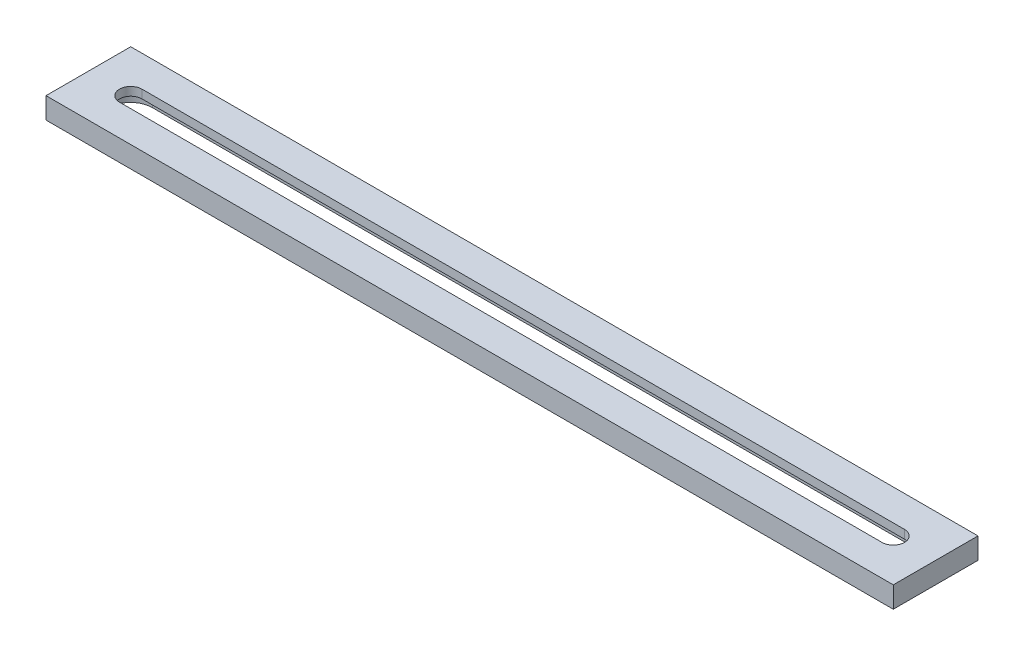
ISO-10303-21;
HEADER;
FILE_DESCRIPTION(('STEP AP214'),'2;1');
FILE_NAME('part.step','',(''),(''),'','','');
FILE_SCHEMA(('AUTOMOTIVE_DESIGN { 1 0 10303 214 1 1 1 1 }'));
ENDSEC;
DATA;
#1=APPLICATION_CONTEXT('core data for automotive mechanical design processes');
#2=APPLICATION_PROTOCOL_DEFINITION('international standard','automotive_design',2000,#1);
#3=PRODUCT_CONTEXT('',#1,'mechanical');
#4=PRODUCT('Part','Part','',(#3));
#5=PRODUCT_RELATED_PRODUCT_CATEGORY('part','',(#4));
#6=PRODUCT_DEFINITION_FORMATION('','',#4);
#7=PRODUCT_DEFINITION_CONTEXT('part definition',#1,'design');
#8=PRODUCT_DEFINITION('design','',#6,#7);
#9=PRODUCT_DEFINITION_SHAPE('','',#8);
#10=(LENGTH_UNIT() NAMED_UNIT(*) SI_UNIT(.MILLI.,.METRE.));
#11=(NAMED_UNIT(*) PLANE_ANGLE_UNIT() SI_UNIT($,.RADIAN.));
#12=(NAMED_UNIT(*) SI_UNIT($,.STERADIAN.) SOLID_ANGLE_UNIT());
#13=UNCERTAINTY_MEASURE_WITH_UNIT(LENGTH_MEASURE(1.E-05),#10,'distance_accuracy_value','');
#14=(GEOMETRIC_REPRESENTATION_CONTEXT(3) GLOBAL_UNCERTAINTY_ASSIGNED_CONTEXT((#13)) GLOBAL_UNIT_ASSIGNED_CONTEXT((#10,
#11,#12)) REPRESENTATION_CONTEXT('',''));
#15=CARTESIAN_POINT('',(0.,0.,0.));
#16=DIRECTION('',(0.,0.,1.));
#17=DIRECTION('',(1.,0.,0.));
#18=AXIS2_PLACEMENT_3D('',#15,#16,#17);
#19=CARTESIAN_POINT('',(-114.3,0.,0.));
#20=DIRECTION('',(0.,1.,0.));
#21=DIRECTION('',(0.,0.,1.));
#22=AXIS2_PLACEMENT_3D('',#19,#20,#21);
#23=CYLINDRICAL_SURFACE('',#22,3.3782);
#24=CARTESIAN_POINT('',(-114.3,3.81,0.));
#25=DIRECTION('',(0.,-1.,0.));
#26=DIRECTION('',(0.,0.,-1.));
#27=AXIS2_PLACEMENT_3D('',#24,#25,#26);
#28=CIRCLE('',#27,3.3782);
#29=CARTESIAN_POINT('',(-114.3,3.81,-3.37819999999997));
#30=VERTEX_POINT('',#29);
#31=CARTESIAN_POINT('',(-114.3,3.81,3.37820000000003));
#32=VERTEX_POINT('',#31);
#33=EDGE_CURVE('E55',#30,#32,#28,.F.);
#34=ORIENTED_EDGE('',*,*,#33,.F.);
#35=DIRECTION('',(0.,1.,0.));
#36=VECTOR('',#35,1.);
#37=CARTESIAN_POINT('',(-114.3,0.,-3.37819999999997));
#38=LINE('',#37,#36);
#39=CARTESIAN_POINT('',(-114.3,6.35,-3.37819999999997));
#40=VERTEX_POINT('',#39);
#41=EDGE_CURVE('E177',#30,#40,#38,.T.);
#42=ORIENTED_EDGE('',*,*,#41,.T.);
#43=CARTESIAN_POINT('',(-114.3,6.35,0.));
#44=DIRECTION('',(0.,1.,0.));
#45=DIRECTION('',(0.,0.,1.));
#46=AXIS2_PLACEMENT_3D('',#43,#44,#45);
#47=CIRCLE('',#46,3.3782);
#48=CARTESIAN_POINT('',(-114.3,6.35,3.37820000000003));
#49=VERTEX_POINT('',#48);
#50=EDGE_CURVE('E164',#40,#49,#47,.T.);
#51=ORIENTED_EDGE('',*,*,#50,.T.);
#52=DIRECTION('',(0.,1.,0.));
#53=VECTOR('',#52,1.);
#54=CARTESIAN_POINT('',(-114.3,0.,3.37820000000003));
#55=LINE('',#54,#53);
#56=EDGE_CURVE('E176',#32,#49,#55,.T.);
#57=ORIENTED_EDGE('',*,*,#56,.F.);
#58=EDGE_LOOP('',(#34,#42,#51,#57));
#59=FACE_BOUND('',#58,.T.);
#60=ADVANCED_FACE('F33',(#59),#23,.F.);
#61=CARTESIAN_POINT('',(-114.3,0.,-3.37819999999997));
#62=DIRECTION('',(0.,0.,-1.));
#63=DIRECTION('',(-1.,0.,0.));
#64=AXIS2_PLACEMENT_3D('',#61,#62,#63);
#65=PLANE('',#64);
#66=DIRECTION('',(-1.,0.,0.));
#67=VECTOR('',#66,1.);
#68=CARTESIAN_POINT('',(-114.3,3.81,-3.37819999999997));
#69=LINE('',#68,#67);
#70=CARTESIAN_POINT('',(114.3,3.81,-3.37820000000004));
#71=VERTEX_POINT('',#70);
#72=EDGE_CURVE('E161',#71,#30,#69,.T.);
#73=ORIENTED_EDGE('',*,*,#72,.F.);
#74=DIRECTION('',(0.,1.,0.));
#75=VECTOR('',#74,1.);
#76=CARTESIAN_POINT('',(114.3,0.,-3.37820000000001));
#77=LINE('',#76,#75);
#78=CARTESIAN_POINT('',(114.3,6.35,-3.37820000000001));
#79=VERTEX_POINT('',#78);
#80=EDGE_CURVE('E180',#71,#79,#77,.T.);
#81=ORIENTED_EDGE('',*,*,#80,.T.);
#82=DIRECTION('',(-1.,0.,0.));
#83=VECTOR('',#82,1.);
#84=CARTESIAN_POINT('',(-114.3,6.35,-3.37819999999997));
#85=LINE('',#84,#83);
#86=EDGE_CURVE('E173',#79,#40,#85,.T.);
#87=ORIENTED_EDGE('',*,*,#86,.T.);
#88=ORIENTED_EDGE('',*,*,#41,.F.);
#89=EDGE_LOOP('',(#73,#81,#87,#88));
#90=FACE_BOUND('',#89,.T.);
#91=ADVANCED_FACE('F245',(#90),#65,.F.);
#92=CARTESIAN_POINT('',(114.3,0.,0.));
#93=DIRECTION('',(0.,1.,0.));
#94=DIRECTION('',(0.,0.,1.));
#95=AXIS2_PLACEMENT_3D('',#92,#93,#94);
#96=CYLINDRICAL_SURFACE('',#95,3.3782);
#97=CARTESIAN_POINT('',(114.3,3.81,0.));
#98=DIRECTION('',(0.,-1.,0.));
#99=DIRECTION('',(0.,0.,-1.));
#100=AXIS2_PLACEMENT_3D('',#97,#98,#99);
#101=CIRCLE('',#100,3.3782);
#102=CARTESIAN_POINT('',(114.3,3.81,3.37819999999999));
#103=VERTEX_POINT('',#102);
#104=EDGE_CURVE('E156',#103,#71,#101,.F.);
#105=ORIENTED_EDGE('',*,*,#104,.F.);
#106=DIRECTION('',(0.,1.,0.));
#107=VECTOR('',#106,1.);
#108=CARTESIAN_POINT('',(114.3,0.,3.37819999999996));
#109=LINE('',#108,#107);
#110=CARTESIAN_POINT('',(114.3,6.35,3.37819999999996));
#111=VERTEX_POINT('',#110);
#112=EDGE_CURVE('E182',#103,#111,#109,.T.);
#113=ORIENTED_EDGE('',*,*,#112,.T.);
#114=CARTESIAN_POINT('',(114.3,6.35,0.));
#115=DIRECTION('',(0.,1.,0.));
#116=DIRECTION('',(0.,0.,1.));
#117=AXIS2_PLACEMENT_3D('',#114,#115,#116);
#118=CIRCLE('',#117,3.3782);
#119=EDGE_CURVE('E170',#111,#79,#118,.T.);
#120=ORIENTED_EDGE('',*,*,#119,.T.);
#121=ORIENTED_EDGE('',*,*,#80,.F.);
#122=EDGE_LOOP('',(#105,#113,#120,#121));
#123=FACE_BOUND('',#122,.T.);
#124=ADVANCED_FACE('F250',(#123),#96,.F.);
#125=CARTESIAN_POINT('',(-114.3,0.,3.37820000000003));
#126=DIRECTION('',(0.,0.,1.));
#127=DIRECTION('',(1.,0.,0.));
#128=AXIS2_PLACEMENT_3D('',#125,#126,#127);
#129=PLANE('',#128);
#130=DIRECTION('',(1.,0.,0.));
#131=VECTOR('',#130,1.);
#132=CARTESIAN_POINT('',(-114.3,3.81,3.37820000000003));
#133=LINE('',#132,#131);
#134=EDGE_CURVE('E11',#32,#103,#133,.T.);
#135=ORIENTED_EDGE('',*,*,#134,.F.);
#136=ORIENTED_EDGE('',*,*,#56,.T.);
#137=DIRECTION('',(1.,0.,0.));
#138=VECTOR('',#137,1.);
#139=CARTESIAN_POINT('',(-114.3,6.35,3.37820000000003));
#140=LINE('',#139,#138);
#141=EDGE_CURVE('E167',#49,#111,#140,.T.);
#142=ORIENTED_EDGE('',*,*,#141,.T.);
#143=ORIENTED_EDGE('',*,*,#112,.F.);
#144=EDGE_LOOP('',(#135,#136,#142,#143));
#145=FACE_BOUND('',#144,.T.);
#146=ADVANCED_FACE('F254',(#145),#129,.F.);
#147=CARTESIAN_POINT('',(127.,6.35,12.7));
#148=DIRECTION('',(-1.,0.,0.));
#149=DIRECTION('',(0.,0.,1.));
#150=AXIS2_PLACEMENT_3D('',#147,#148,#149);
#151=PLANE('',#150);
#152=DIRECTION('',(0.,0.,-1.));
#153=VECTOR('',#152,1.);
#154=CARTESIAN_POINT('',(127.,0.,12.7));
#155=LINE('',#154,#153);
#156=CARTESIAN_POINT('',(127.,0.,12.7));
#157=VERTEX_POINT('',#156);
#158=CARTESIAN_POINT('',(127.,0.,-12.7));
#159=VERTEX_POINT('',#158);
#160=EDGE_CURVE('E179',#157,#159,#155,.T.);
#161=ORIENTED_EDGE('',*,*,#160,.T.);
#162=DIRECTION('',(0.,-1.,0.));
#163=VECTOR('',#162,1.);
#164=CARTESIAN_POINT('',(127.,6.35,-12.7));
#165=LINE('',#164,#163);
#166=CARTESIAN_POINT('',(127.,6.35,-12.7));
#167=VERTEX_POINT('',#166);
#168=EDGE_CURVE('E41',#167,#159,#165,.T.);
#169=ORIENTED_EDGE('',*,*,#168,.F.);
#170=DIRECTION('',(0.,0.,-1.));
#171=VECTOR('',#170,1.);
#172=CARTESIAN_POINT('',(127.,6.35,12.7));
#173=LINE('',#172,#171);
#174=CARTESIAN_POINT('',(127.,6.35,12.7));
#175=VERTEX_POINT('',#174);
#176=EDGE_CURVE('E185',#175,#167,#173,.T.);
#177=ORIENTED_EDGE('',*,*,#176,.F.);
#178=DIRECTION('',(0.,-1.,0.));
#179=VECTOR('',#178,1.);
#180=CARTESIAN_POINT('',(127.,6.35,12.7));
#181=LINE('',#180,#179);
#182=EDGE_CURVE('E195',#175,#157,#181,.T.);
#183=ORIENTED_EDGE('',*,*,#182,.T.);
#184=EDGE_LOOP('',(#161,#169,#177,#183));
#185=FACE_BOUND('',#184,.T.);
#186=ADVANCED_FACE('F35',(#185),#151,.F.);
#187=CARTESIAN_POINT('',(-127.,6.35,-12.7));
#188=DIRECTION('',(0.,0.,1.));
#189=DIRECTION('',(1.,0.,0.));
#190=AXIS2_PLACEMENT_3D('',#187,#188,#189);
#191=PLANE('',#190);
#192=DIRECTION('',(-1.,0.,0.));
#193=VECTOR('',#192,1.);
#194=CARTESIAN_POINT('',(-127.,0.,-12.7));
#195=LINE('',#194,#193);
#196=CARTESIAN_POINT('',(-127.,0.,-12.7));
#197=VERTEX_POINT('',#196);
#198=EDGE_CURVE('E198',#159,#197,#195,.T.);
#199=ORIENTED_EDGE('',*,*,#198,.T.);
#200=DIRECTION('',(0.,-1.,0.));
#201=VECTOR('',#200,1.);
#202=CARTESIAN_POINT('',(-127.,6.35,-12.7));
#203=LINE('',#202,#201);
#204=CARTESIAN_POINT('',(-127.,6.35,-12.7));
#205=VERTEX_POINT('',#204);
#206=EDGE_CURVE('E208',#205,#197,#203,.T.);
#207=ORIENTED_EDGE('',*,*,#206,.F.);
#208=DIRECTION('',(-1.,0.,0.));
#209=VECTOR('',#208,1.);
#210=CARTESIAN_POINT('',(-127.,6.35,-12.7));
#211=LINE('',#210,#209);
#212=EDGE_CURVE('E188',#167,#205,#211,.T.);
#213=ORIENTED_EDGE('',*,*,#212,.F.);
#214=ORIENTED_EDGE('',*,*,#168,.T.);
#215=EDGE_LOOP('',(#199,#207,#213,#214));
#216=FACE_BOUND('',#215,.T.);
#217=ADVANCED_FACE('F213',(#216),#191,.F.);
#218=CARTESIAN_POINT('',(-127.,6.35,12.7));
#219=DIRECTION('',(1.,0.,0.));
#220=DIRECTION('',(0.,0.,-1.));
#221=AXIS2_PLACEMENT_3D('',#218,#219,#220);
#222=PLANE('',#221);
#223=DIRECTION('',(0.,0.,1.));
#224=VECTOR('',#223,1.);
#225=CARTESIAN_POINT('',(-127.,0.,12.7));
#226=LINE('',#225,#224);
#227=CARTESIAN_POINT('',(-127.,0.,12.7));
#228=VERTEX_POINT('',#227);
#229=EDGE_CURVE('E200',#197,#228,#226,.T.);
#230=ORIENTED_EDGE('',*,*,#229,.T.);
#231=DIRECTION('',(0.,-1.,0.));
#232=VECTOR('',#231,1.);
#233=CARTESIAN_POINT('',(-127.,6.35,12.7));
#234=LINE('',#233,#232);
#235=CARTESIAN_POINT('',(-127.,6.35,12.7));
#236=VERTEX_POINT('',#235);
#237=EDGE_CURVE('E205',#236,#228,#234,.T.);
#238=ORIENTED_EDGE('',*,*,#237,.F.);
#239=DIRECTION('',(0.,0.,1.));
#240=VECTOR('',#239,1.);
#241=CARTESIAN_POINT('',(-127.,6.35,12.7));
#242=LINE('',#241,#240);
#243=EDGE_CURVE('E191',#205,#236,#242,.T.);
#244=ORIENTED_EDGE('',*,*,#243,.F.);
#245=ORIENTED_EDGE('',*,*,#206,.T.);
#246=EDGE_LOOP('',(#230,#238,#244,#245));
#247=FACE_BOUND('',#246,.T.);
#248=ADVANCED_FACE('F225',(#247),#222,.F.);
#249=CARTESIAN_POINT('',(-127.,6.35,12.7));
#250=DIRECTION('',(0.,0.,-1.));
#251=DIRECTION('',(-1.,0.,0.));
#252=AXIS2_PLACEMENT_3D('',#249,#250,#251);
#253=PLANE('',#252);
#254=DIRECTION('',(1.,0.,0.));
#255=VECTOR('',#254,1.);
#256=CARTESIAN_POINT('',(-127.,0.,12.7));
#257=LINE('',#256,#255);
#258=EDGE_CURVE('E189',#228,#157,#257,.T.);
#259=ORIENTED_EDGE('',*,*,#258,.T.);
#260=ORIENTED_EDGE('',*,*,#182,.F.);
#261=DIRECTION('',(1.,0.,0.));
#262=VECTOR('',#261,1.);
#263=CARTESIAN_POINT('',(-127.,6.35,12.7));
#264=LINE('',#263,#262);
#265=EDGE_CURVE('E193',#236,#175,#264,.T.);
#266=ORIENTED_EDGE('',*,*,#265,.F.);
#267=ORIENTED_EDGE('',*,*,#237,.T.);
#268=EDGE_LOOP('',(#259,#260,#266,#267));
#269=FACE_BOUND('',#268,.T.);
#270=ADVANCED_FACE('F229',(#269),#253,.F.);
#271=CARTESIAN_POINT('',(0.,6.35,0.));
#272=DIRECTION('',(0.,-1.,0.));
#273=DIRECTION('',(0.,0.,-1.));
#274=AXIS2_PLACEMENT_3D('',#271,#272,#273);
#275=PLANE('',#274);
#276=ORIENTED_EDGE('',*,*,#141,.F.);
#277=ORIENTED_EDGE('',*,*,#50,.F.);
#278=ORIENTED_EDGE('',*,*,#86,.F.);
#279=ORIENTED_EDGE('',*,*,#119,.F.);
#280=EDGE_LOOP('',(#276,#277,#278,#279));
#281=FACE_BOUND('',#280,.T.);
#282=ORIENTED_EDGE('',*,*,#176,.T.);
#283=ORIENTED_EDGE('',*,*,#212,.T.);
#284=ORIENTED_EDGE('',*,*,#243,.T.);
#285=ORIENTED_EDGE('',*,*,#265,.T.);
#286=EDGE_LOOP('',(#282,#283,#284,#285));
#287=FACE_BOUND('',#286,.T.);
#288=ADVANCED_FACE('F231',(#281,#287),#275,.F.);
#289=CARTESIAN_POINT('',(0.,0.,0.));
#290=DIRECTION('',(0.,-1.,0.));
#291=DIRECTION('',(0.,0.,-1.));
#292=AXIS2_PLACEMENT_3D('',#289,#290,#291);
#293=PLANE('',#292);
#294=CARTESIAN_POINT('',(-114.3,0.,0.));
#295=DIRECTION('',(0.,-1.,0.));
#296=DIRECTION('',(0.,0.,-1.));
#297=AXIS2_PLACEMENT_3D('',#294,#295,#296);
#298=CIRCLE('',#297,6.477);
#299=CARTESIAN_POINT('',(-114.3,0.,6.477));
#300=VERTEX_POINT('',#299);
#301=CARTESIAN_POINT('',(-114.3,0.,-6.477));
#302=VERTEX_POINT('',#301);
#303=EDGE_CURVE('E48',#300,#302,#298,.T.);
#304=ORIENTED_EDGE('',*,*,#303,.F.);
#305=DIRECTION('',(-1.,0.,0.));
#306=VECTOR('',#305,1.);
#307=CARTESIAN_POINT('',(-114.3,0.,6.477));
#308=LINE('',#307,#306);
#309=CARTESIAN_POINT('',(114.3,0.,6.47700000000004));
#310=VERTEX_POINT('',#309);
#311=EDGE_CURVE('E141',#310,#300,#308,.T.);
#312=ORIENTED_EDGE('',*,*,#311,.F.);
#313=CARTESIAN_POINT('',(114.3,0.,0.));
#314=DIRECTION('',(0.,-1.,0.));
#315=DIRECTION('',(0.,0.,-1.));
#316=AXIS2_PLACEMENT_3D('',#313,#314,#315);
#317=CIRCLE('',#316,6.477);
#318=CARTESIAN_POINT('',(114.3,0.,-6.47700000000004));
#319=VERTEX_POINT('',#318);
#320=EDGE_CURVE('E144',#319,#310,#317,.T.);
#321=ORIENTED_EDGE('',*,*,#320,.F.);
#322=DIRECTION('',(1.,0.,0.));
#323=VECTOR('',#322,1.);
#324=CARTESIAN_POINT('',(-114.3,0.,-6.477));
#325=LINE('',#324,#323);
#326=EDGE_CURVE('E150',#302,#319,#325,.T.);
#327=ORIENTED_EDGE('',*,*,#326,.F.);
#328=EDGE_LOOP('',(#304,#312,#321,#327));
#329=FACE_BOUND('',#328,.T.);
#330=ORIENTED_EDGE('',*,*,#160,.F.);
#331=ORIENTED_EDGE('',*,*,#258,.F.);
#332=ORIENTED_EDGE('',*,*,#229,.F.);
#333=ORIENTED_EDGE('',*,*,#198,.F.);
#334=EDGE_LOOP('',(#330,#331,#332,#333));
#335=FACE_BOUND('',#334,.T.);
#336=ADVANCED_FACE('F221',(#329,#335),#293,.T.);
#337=CARTESIAN_POINT('',(-114.3,3.81,0.));
#338=DIRECTION('',(0.,-1.,0.));
#339=DIRECTION('',(0.,0.,-1.));
#340=AXIS2_PLACEMENT_3D('',#337,#338,#339);
#341=PLANE('',#340);
#342=CARTESIAN_POINT('',(-114.3,3.81,0.));
#343=DIRECTION('',(0.,-1.,0.));
#344=DIRECTION('',(0.,0.,-1.));
#345=AXIS2_PLACEMENT_3D('',#342,#343,#344);
#346=CIRCLE('',#345,6.477);
#347=CARTESIAN_POINT('',(-114.3,3.81,6.477));
#348=VERTEX_POINT('',#347);
#349=CARTESIAN_POINT('',(-114.3,3.81,-6.477));
#350=VERTEX_POINT('',#349);
#351=EDGE_CURVE('E123',#348,#350,#346,.T.);
#352=ORIENTED_EDGE('',*,*,#351,.T.);
#353=DIRECTION('',(1.,0.,0.));
#354=VECTOR('',#353,1.);
#355=CARTESIAN_POINT('',(-114.3,3.81,-6.477));
#356=LINE('',#355,#354);
#357=CARTESIAN_POINT('',(114.3,3.81,-6.47700000000004));
#358=VERTEX_POINT('',#357);
#359=EDGE_CURVE('E132',#350,#358,#356,.T.);
#360=ORIENTED_EDGE('',*,*,#359,.T.);
#361=CARTESIAN_POINT('',(114.3,3.81,0.));
#362=DIRECTION('',(0.,-1.,0.));
#363=DIRECTION('',(0.,0.,-1.));
#364=AXIS2_PLACEMENT_3D('',#361,#362,#363);
#365=CIRCLE('',#364,6.477);
#366=CARTESIAN_POINT('',(114.3,3.81,6.47700000000004));
#367=VERTEX_POINT('',#366);
#368=EDGE_CURVE('E137',#358,#367,#365,.T.);
#369=ORIENTED_EDGE('',*,*,#368,.T.);
#370=DIRECTION('',(-1.,0.,0.));
#371=VECTOR('',#370,1.);
#372=CARTESIAN_POINT('',(-114.3,3.81,6.477));
#373=LINE('',#372,#371);
#374=EDGE_CURVE('E129',#367,#348,#373,.T.);
#375=ORIENTED_EDGE('',*,*,#374,.T.);
#376=EDGE_LOOP('',(#352,#360,#369,#375));
#377=FACE_BOUND('',#376,.T.);
#378=ORIENTED_EDGE('',*,*,#33,.T.);
#379=ORIENTED_EDGE('',*,*,#134,.T.);
#380=ORIENTED_EDGE('',*,*,#104,.T.);
#381=ORIENTED_EDGE('',*,*,#72,.T.);
#382=EDGE_LOOP('',(#378,#379,#380,#381));
#383=FACE_BOUND('',#382,.T.);
#384=ADVANCED_FACE('F139',(#377,#383),#341,.T.);
#385=CARTESIAN_POINT('',(-114.3,3.81,0.));
#386=DIRECTION('',(0.,-1.,0.));
#387=DIRECTION('',(0.,0.,-1.));
#388=AXIS2_PLACEMENT_3D('',#385,#386,#387);
#389=CYLINDRICAL_SURFACE('',#388,6.477);
#390=ORIENTED_EDGE('',*,*,#303,.T.);
#391=DIRECTION('',(0.,-1.,0.));
#392=VECTOR('',#391,1.);
#393=CARTESIAN_POINT('',(-114.3,3.81,-6.477));
#394=LINE('',#393,#392);
#395=EDGE_CURVE('E119',#350,#302,#394,.T.);
#396=ORIENTED_EDGE('',*,*,#395,.F.);
#397=ORIENTED_EDGE('',*,*,#351,.F.);
#398=DIRECTION('',(0.,-1.,0.));
#399=VECTOR('',#398,1.);
#400=CARTESIAN_POINT('',(-114.3,3.81,6.477));
#401=LINE('',#400,#399);
#402=EDGE_CURVE('E154',#348,#300,#401,.T.);
#403=ORIENTED_EDGE('',*,*,#402,.T.);
#404=EDGE_LOOP('',(#390,#396,#397,#403));
#405=FACE_BOUND('',#404,.T.);
#406=ADVANCED_FACE('F121',(#405),#389,.F.);
#407=CARTESIAN_POINT('',(-114.3,3.81,6.477));
#408=DIRECTION('',(0.,0.,1.));
#409=DIRECTION('',(1.,0.,0.));
#410=AXIS2_PLACEMENT_3D('',#407,#408,#409);
#411=PLANE('',#410);
#412=ORIENTED_EDGE('',*,*,#311,.T.);
#413=ORIENTED_EDGE('',*,*,#402,.F.);
#414=ORIENTED_EDGE('',*,*,#374,.F.);
#415=DIRECTION('',(0.,-1.,0.));
#416=VECTOR('',#415,1.);
#417=CARTESIAN_POINT('',(114.3,3.81,6.47700000000004));
#418=LINE('',#417,#416);
#419=EDGE_CURVE('E157',#367,#310,#418,.T.);
#420=ORIENTED_EDGE('',*,*,#419,.T.);
#421=EDGE_LOOP('',(#412,#413,#414,#420));
#422=FACE_BOUND('',#421,.T.);
#423=ADVANCED_FACE('F263',(#422),#411,.F.);
#424=CARTESIAN_POINT('',(114.3,3.81,0.));
#425=DIRECTION('',(0.,-1.,0.));
#426=DIRECTION('',(0.,0.,-1.));
#427=AXIS2_PLACEMENT_3D('',#424,#425,#426);
#428=CYLINDRICAL_SURFACE('',#427,6.477);
#429=ORIENTED_EDGE('',*,*,#320,.T.);
#430=ORIENTED_EDGE('',*,*,#419,.F.);
#431=ORIENTED_EDGE('',*,*,#368,.F.);
#432=DIRECTION('',(0.,-1.,0.));
#433=VECTOR('',#432,1.);
#434=CARTESIAN_POINT('',(114.3,3.81,-6.47700000000004));
#435=LINE('',#434,#433);
#436=EDGE_CURVE('E128',#358,#319,#435,.T.);
#437=ORIENTED_EDGE('',*,*,#436,.T.);
#438=EDGE_LOOP('',(#429,#430,#431,#437));
#439=FACE_BOUND('',#438,.T.);
#440=ADVANCED_FACE('F266',(#439),#428,.F.);
#441=CARTESIAN_POINT('',(-114.3,3.81,-6.477));
#442=DIRECTION('',(0.,0.,-1.));
#443=DIRECTION('',(-1.,0.,0.));
#444=AXIS2_PLACEMENT_3D('',#441,#442,#443);
#445=PLANE('',#444);
#446=ORIENTED_EDGE('',*,*,#326,.T.);
#447=ORIENTED_EDGE('',*,*,#436,.F.);
#448=ORIENTED_EDGE('',*,*,#359,.F.);
#449=ORIENTED_EDGE('',*,*,#395,.T.);
#450=EDGE_LOOP('',(#446,#447,#448,#449));
#451=FACE_BOUND('',#450,.T.);
#452=ADVANCED_FACE('F133',(#451),#445,.F.);
#453=CLOSED_SHELL('',(#60,#91,#124,#146,#186,#217,#248,#270,#288,#336,#384,#406,#423,#440,#452));
#454=MANIFOLD_SOLID_BREP('B2',#453);
#455=ADVANCED_BREP_SHAPE_REPRESENTATION('',(#18,#454),#14);
#456=SHAPE_DEFINITION_REPRESENTATION(#9,#455);
ENDSEC;
END-ISO-10303-21;
